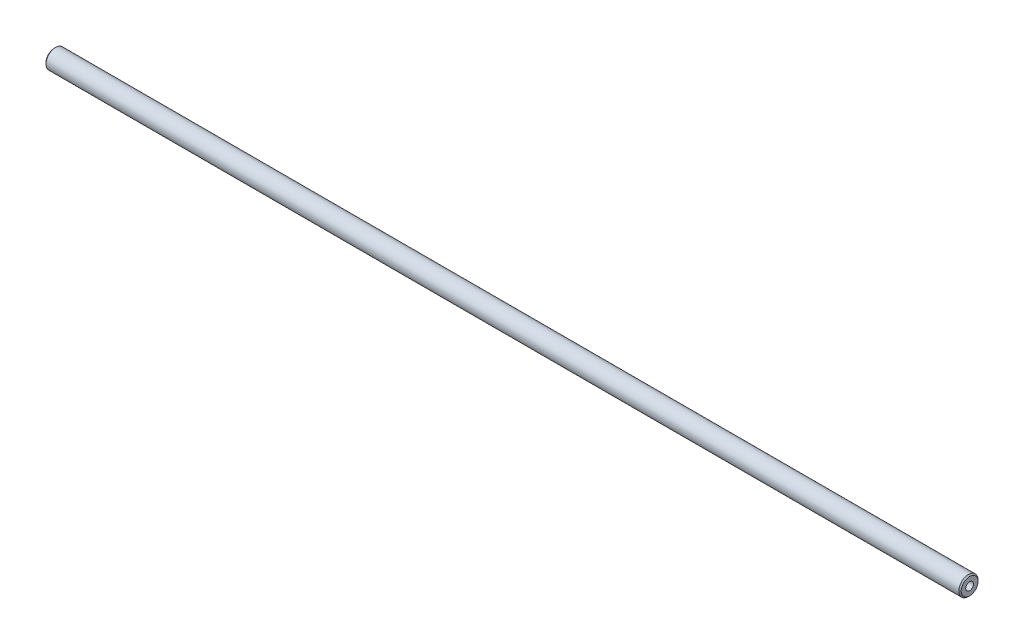
ISO-10303-21;
HEADER;
FILE_DESCRIPTION(('STEP AP214'),'2;1');
FILE_NAME('part.step','',(''),(''),'','','');
FILE_SCHEMA(('AUTOMOTIVE_DESIGN { 1 0 10303 214 1 1 1 1 }'));
ENDSEC;
DATA;
#1=APPLICATION_CONTEXT('core data for automotive mechanical design processes');
#2=APPLICATION_PROTOCOL_DEFINITION('international standard','automotive_design',2000,#1);
#3=PRODUCT_CONTEXT('',#1,'mechanical');
#4=PRODUCT('Part','Part','',(#3));
#5=PRODUCT_RELATED_PRODUCT_CATEGORY('part','',(#4));
#6=PRODUCT_DEFINITION_FORMATION('','',#4);
#7=PRODUCT_DEFINITION_CONTEXT('part definition',#1,'design');
#8=PRODUCT_DEFINITION('design','',#6,#7);
#9=PRODUCT_DEFINITION_SHAPE('','',#8);
#10=(LENGTH_UNIT() NAMED_UNIT(*) SI_UNIT(.MILLI.,.METRE.));
#11=(NAMED_UNIT(*) PLANE_ANGLE_UNIT() SI_UNIT($,.RADIAN.));
#12=(NAMED_UNIT(*) SI_UNIT($,.STERADIAN.) SOLID_ANGLE_UNIT());
#13=UNCERTAINTY_MEASURE_WITH_UNIT(LENGTH_MEASURE(1.E-05),#10,'distance_accuracy_value','');
#14=(GEOMETRIC_REPRESENTATION_CONTEXT(3) GLOBAL_UNCERTAINTY_ASSIGNED_CONTEXT((#13)) GLOBAL_UNIT_ASSIGNED_CONTEXT((#10,
#11,#12)) REPRESENTATION_CONTEXT('',''));
#15=CARTESIAN_POINT('',(0.,0.,0.));
#16=DIRECTION('',(0.,0.,1.));
#17=DIRECTION('',(1.,0.,0.));
#18=AXIS2_PLACEMENT_3D('',#15,#16,#17);
#19=CARTESIAN_POINT('',(-190.960000000075,0.,0.));
#20=DIRECTION('',(1.,0.,0.));
#21=DIRECTION('',(0.,0.,-1.));
#22=AXIS2_PLACEMENT_3D('',#19,#20,#21);
#23=CYLINDRICAL_SURFACE('',#22,1.62100000000008);
#24=CARTESIAN_POINT('',(-175.8,0.,0.));
#25=DIRECTION('',(1.,0.,0.));
#26=DIRECTION('',(0.,0.,-1.));
#27=AXIS2_PLACEMENT_3D('',#24,#25,#26);
#28=CIRCLE('',#27,1.62100000000008);
#29=CARTESIAN_POINT('',(-175.8,0.,-1.62100000000008));
#30=VERTEX_POINT('',#29);
#31=EDGE_CURVE('E11',#30,#30,#28,.T.);
#32=ORIENTED_EDGE('',*,*,#31,.T.);
#33=EDGE_LOOP('',(#32));
#34=FACE_BOUND('',#33,.T.);
#35=CARTESIAN_POINT('',(-190.8,0.,0.));
#36=DIRECTION('',(1.,0.,0.));
#37=DIRECTION('',(0.,0.,-1.));
#38=AXIS2_PLACEMENT_3D('',#35,#36,#37);
#39=CIRCLE('',#38,1.62100000000008);
#40=CARTESIAN_POINT('',(-190.8,0.,-1.62100000000008));
#41=VERTEX_POINT('',#40);
#42=EDGE_CURVE('E64',#41,#41,#39,.T.);
#43=ORIENTED_EDGE('',*,*,#42,.F.);
#44=EDGE_LOOP('',(#43));
#45=FACE_BOUND('',#44,.T.);
#46=ADVANCED_FACE('F38',(#34,#45),#23,.F.);
#47=CARTESIAN_POINT('',(-175.8,0.,0.));
#48=DIRECTION('',(-1.,0.,0.));
#49=DIRECTION('',(0.,0.,1.));
#50=AXIS2_PLACEMENT_3D('',#47,#48,#49);
#51=CONICAL_SURFACE('',#50,1.62100000000008,1.02974425866126);
#52=CARTESIAN_POINT('',(-174.826004936522,0.,0.));
#53=VERTEX_POINT('',#52);
#54=VERTEX_LOOP('',#53);
#55=FACE_BOUND('',#54,.T.);
#56=ORIENTED_EDGE('',*,*,#31,.F.);
#57=EDGE_LOOP('',(#56));
#58=FACE_BOUND('',#57,.T.);
#59=ADVANCED_FACE('F54',(#55,#58),#51,.F.);
#60=CARTESIAN_POINT('',(174.826004936522,0.,0.));
#61=DIRECTION('',(1.,0.,0.));
#62=DIRECTION('',(0.,0.,-1.));
#63=AXIS2_PLACEMENT_3D('',#60,#61,#62);
#64=CONICAL_SURFACE('',#63,0.,1.02974425866123);
#65=CARTESIAN_POINT('',(175.8,0.,0.));
#66=DIRECTION('',(1.,0.,0.));
#67=DIRECTION('',(0.,0.,-1.));
#68=AXIS2_PLACEMENT_3D('',#65,#66,#67);
#69=CIRCLE('',#68,1.62100000000008);
#70=CARTESIAN_POINT('',(175.8,0.,-1.62100000000008));
#71=VERTEX_POINT('',#70);
#72=EDGE_CURVE('E46',#71,#71,#69,.T.);
#73=ORIENTED_EDGE('',*,*,#72,.T.);
#74=EDGE_LOOP('',(#73));
#75=FACE_BOUND('',#74,.T.);
#76=CARTESIAN_POINT('',(174.826004936522,0.,0.));
#77=VERTEX_POINT('',#76);
#78=VERTEX_LOOP('',#77);
#79=FACE_BOUND('',#78,.T.);
#80=ADVANCED_FACE('F57',(#75,#79),#64,.F.);
#81=CARTESIAN_POINT('',(-190.960000000075,0.,0.));
#82=DIRECTION('',(1.,0.,0.));
#83=DIRECTION('',(0.,0.,-1.));
#84=AXIS2_PLACEMENT_3D('',#81,#82,#83);
#85=CYLINDRICAL_SURFACE('',#84,1.62100000000008);
#86=CARTESIAN_POINT('',(190.8,0.,0.));
#87=DIRECTION('',(1.,0.,0.));
#88=DIRECTION('',(0.,0.,-1.));
#89=AXIS2_PLACEMENT_3D('',#86,#87,#88);
#90=CIRCLE('',#89,1.62100000000008);
#91=CARTESIAN_POINT('',(190.8,0.,-1.62100000000008));
#92=VERTEX_POINT('',#91);
#93=EDGE_CURVE('E85',#92,#92,#90,.T.);
#94=ORIENTED_EDGE('',*,*,#93,.T.);
#95=EDGE_LOOP('',(#94));
#96=FACE_BOUND('',#95,.T.);
#97=ORIENTED_EDGE('',*,*,#72,.F.);
#98=EDGE_LOOP('',(#97));
#99=FACE_BOUND('',#98,.T.);
#100=ADVANCED_FACE('F93',(#96,#99),#85,.F.);
#101=CARTESIAN_POINT('',(190.8,1.62100000000006,0.));
#102=DIRECTION('',(1.,0.,0.));
#103=DIRECTION('',(0.,0.,-1.));
#104=AXIS2_PLACEMENT_3D('',#101,#102,#103);
#105=PLANE('',#104);
#106=CARTESIAN_POINT('',(190.8,0.,0.));
#107=DIRECTION('',(1.,0.,0.));
#108=DIRECTION('',(0.,0.,-1.));
#109=AXIS2_PLACEMENT_3D('',#106,#107,#108);
#110=CIRCLE('',#109,3.50000000003091);
#111=CARTESIAN_POINT('',(190.8,0.,-3.50000000003091));
#112=VERTEX_POINT('',#111);
#113=EDGE_CURVE('E81',#112,#112,#110,.T.);
#114=ORIENTED_EDGE('',*,*,#113,.T.);
#115=EDGE_LOOP('',(#114));
#116=FACE_BOUND('',#115,.T.);
#117=ORIENTED_EDGE('',*,*,#93,.F.);
#118=EDGE_LOOP('',(#117));
#119=FACE_BOUND('',#118,.T.);
#120=ADVANCED_FACE('F95',(#116,#119),#105,.T.);
#121=CARTESIAN_POINT('',(190.8,0.,0.));
#122=DIRECTION('',(-1.,0.,0.));
#123=DIRECTION('',(0.,0.,1.));
#124=AXIS2_PLACEMENT_3D('',#121,#122,#123);
#125=CONICAL_SURFACE('',#124,3.50000000003091,0.78539816339746);
#126=CARTESIAN_POINT('',(190.299999999978,0.,0.));
#127=DIRECTION('',(1.,0.,0.));
#128=DIRECTION('',(0.,0.,-1.));
#129=AXIS2_PLACEMENT_3D('',#126,#127,#128);
#130=CIRCLE('',#129,4.00000000005296);
#131=CARTESIAN_POINT('',(190.299999999978,0.,-4.00000000005296));
#132=VERTEX_POINT('',#131);
#133=EDGE_CURVE('E77',#132,#132,#130,.T.);
#134=ORIENTED_EDGE('',*,*,#133,.T.);
#135=EDGE_LOOP('',(#134));
#136=FACE_BOUND('',#135,.T.);
#137=ORIENTED_EDGE('',*,*,#113,.F.);
#138=EDGE_LOOP('',(#137));
#139=FACE_BOUND('',#138,.T.);
#140=ADVANCED_FACE('F102',(#136,#139),#125,.T.);
#141=CARTESIAN_POINT('',(-190.960000000075,0.,0.));
#142=DIRECTION('',(1.,0.,0.));
#143=DIRECTION('',(0.,0.,-1.));
#144=AXIS2_PLACEMENT_3D('',#141,#142,#143);
#145=CYLINDRICAL_SURFACE('',#144,4.00000000005296);
#146=CARTESIAN_POINT('',(-190.299999999978,0.,0.));
#147=DIRECTION('',(1.,0.,0.));
#148=DIRECTION('',(0.,0.,-1.));
#149=AXIS2_PLACEMENT_3D('',#146,#147,#148);
#150=CIRCLE('',#149,4.00000000005296);
#151=CARTESIAN_POINT('',(-190.299999999978,0.,-4.00000000005296));
#152=VERTEX_POINT('',#151);
#153=EDGE_CURVE('E71',#152,#152,#150,.T.);
#154=ORIENTED_EDGE('',*,*,#153,.T.);
#155=EDGE_LOOP('',(#154));
#156=FACE_BOUND('',#155,.T.);
#157=ORIENTED_EDGE('',*,*,#133,.F.);
#158=EDGE_LOOP('',(#157));
#159=FACE_BOUND('',#158,.T.);
#160=ADVANCED_FACE('F109',(#156,#159),#145,.T.);
#161=CARTESIAN_POINT('',(-190.299999999978,0.,0.));
#162=DIRECTION('',(1.,0.,0.));
#163=DIRECTION('',(0.,0.,-1.));
#164=AXIS2_PLACEMENT_3D('',#161,#162,#163);
#165=CONICAL_SURFACE('',#164,4.00000000005296,0.785398163397432);
#166=CARTESIAN_POINT('',(-190.8,0.,0.));
#167=DIRECTION('',(1.,0.,0.));
#168=DIRECTION('',(0.,0.,-1.));
#169=AXIS2_PLACEMENT_3D('',#166,#167,#168);
#170=CIRCLE('',#169,3.50000000003091);
#171=CARTESIAN_POINT('',(-190.8,0.,-3.50000000003091));
#172=VERTEX_POINT('',#171);
#173=EDGE_CURVE('E67',#172,#172,#170,.T.);
#174=ORIENTED_EDGE('',*,*,#173,.T.);
#175=EDGE_LOOP('',(#174));
#176=FACE_BOUND('',#175,.T.);
#177=ORIENTED_EDGE('',*,*,#153,.F.);
#178=EDGE_LOOP('',(#177));
#179=FACE_BOUND('',#178,.T.);
#180=ADVANCED_FACE('F113',(#176,#179),#165,.T.);
#181=CARTESIAN_POINT('',(-190.8,3.50000000003089,0.));
#182=DIRECTION('',(-1.,0.,0.));
#183=DIRECTION('',(0.,0.,1.));
#184=AXIS2_PLACEMENT_3D('',#181,#182,#183);
#185=PLANE('',#184);
#186=ORIENTED_EDGE('',*,*,#42,.T.);
#187=EDGE_LOOP('',(#186));
#188=FACE_BOUND('',#187,.T.);
#189=ORIENTED_EDGE('',*,*,#173,.F.);
#190=EDGE_LOOP('',(#189));
#191=FACE_BOUND('',#190,.T.);
#192=ADVANCED_FACE('F117',(#188,#191),#185,.T.);
#193=CLOSED_SHELL('',(#46,#59,#80,#100,#120,#140,#160,#180,#192));
#194=MANIFOLD_SOLID_BREP('B2',#193);
#195=ADVANCED_BREP_SHAPE_REPRESENTATION('',(#18,#194),#14);
#196=SHAPE_DEFINITION_REPRESENTATION(#9,#195);
ENDSEC;
END-ISO-10303-21;
